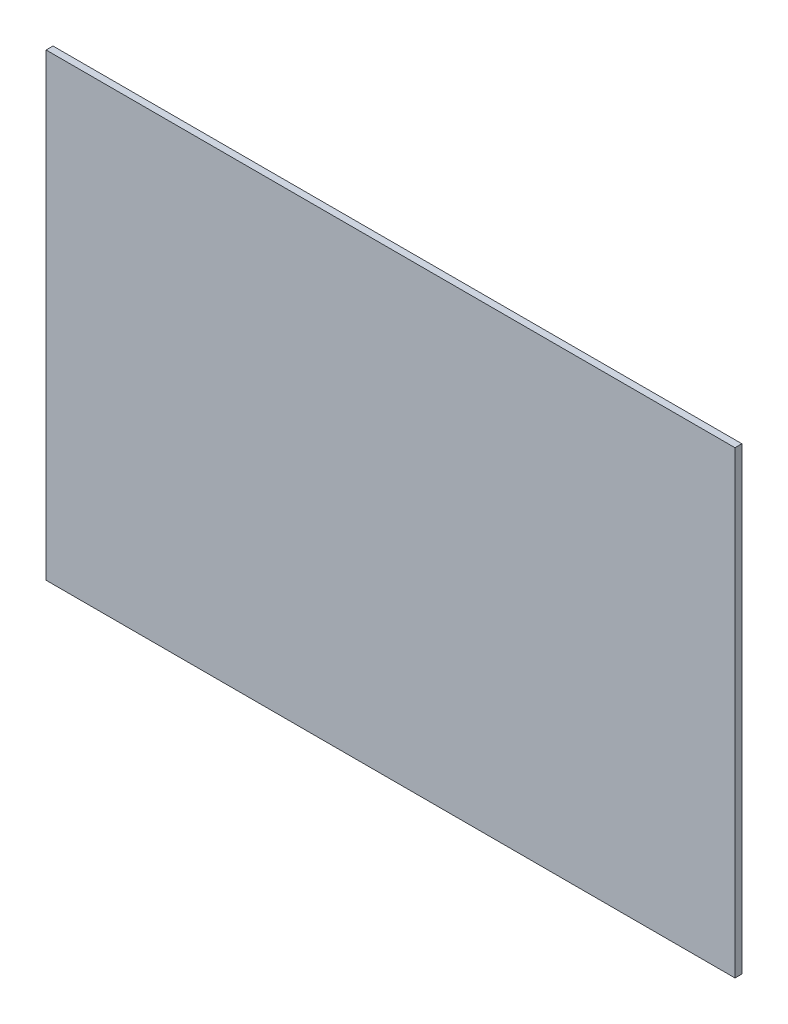
ISO-10303-21;
HEADER;
FILE_DESCRIPTION(('STEP AP214'),'2;1');
FILE_NAME('part.step','',(''),(''),'','','');
FILE_SCHEMA(('AUTOMOTIVE_DESIGN { 1 0 10303 214 1 1 1 1 }'));
ENDSEC;
DATA;
#1=APPLICATION_CONTEXT('core data for automotive mechanical design processes');
#2=APPLICATION_PROTOCOL_DEFINITION('international standard','automotive_design',2000,#1);
#3=PRODUCT_CONTEXT('',#1,'mechanical');
#4=PRODUCT('Part','Part','',(#3));
#5=PRODUCT_RELATED_PRODUCT_CATEGORY('part','',(#4));
#6=PRODUCT_DEFINITION_FORMATION('','',#4);
#7=PRODUCT_DEFINITION_CONTEXT('part definition',#1,'design');
#8=PRODUCT_DEFINITION('design','',#6,#7);
#9=PRODUCT_DEFINITION_SHAPE('','',#8);
#10=(LENGTH_UNIT() NAMED_UNIT(*) SI_UNIT(.MILLI.,.METRE.));
#11=(NAMED_UNIT(*) PLANE_ANGLE_UNIT() SI_UNIT($,.RADIAN.));
#12=(NAMED_UNIT(*) SI_UNIT($,.STERADIAN.) SOLID_ANGLE_UNIT());
#13=UNCERTAINTY_MEASURE_WITH_UNIT(LENGTH_MEASURE(1.E-05),#10,'distance_accuracy_value','');
#14=(GEOMETRIC_REPRESENTATION_CONTEXT(3) GLOBAL_UNCERTAINTY_ASSIGNED_CONTEXT((#13)) GLOBAL_UNIT_ASSIGNED_CONTEXT((#10,
#11,#12)) REPRESENTATION_CONTEXT('',''));
#15=CARTESIAN_POINT('',(0.,0.,0.));
#16=DIRECTION('',(0.,0.,1.));
#17=DIRECTION('',(1.,0.,0.));
#18=AXIS2_PLACEMENT_3D('',#15,#16,#17);
#19=CARTESIAN_POINT('',(726.421853185392,479.838709677419,15.));
#20=DIRECTION('',(-1.,0.,0.));
#21=DIRECTION('',(0.,-1.,0.));
#22=AXIS2_PLACEMENT_3D('',#19,#20,#21);
#23=PLANE('',#22);
#24=DIRECTION('',(0.,1.,0.));
#25=VECTOR('',#24,1.);
#26=CARTESIAN_POINT('',(726.421853185392,479.838709677419,0.));
#27=LINE('',#26,#25);
#28=CARTESIAN_POINT('',(726.421853185392,-520.161290322581,0.));
#29=VERTEX_POINT('',#28);
#30=CARTESIAN_POINT('',(726.421853185392,479.838709677419,0.));
#31=VERTEX_POINT('',#30);
#32=EDGE_CURVE('E96',#29,#31,#27,.T.);
#33=ORIENTED_EDGE('',*,*,#32,.T.);
#34=DIRECTION('',(0.,0.,-1.));
#35=VECTOR('',#34,1.);
#36=CARTESIAN_POINT('',(726.421853185392,479.838709677419,15.));
#37=LINE('',#36,#35);
#38=CARTESIAN_POINT('',(726.421853185392,479.838709677419,15.));
#39=VERTEX_POINT('',#38);
#40=EDGE_CURVE('E11',#39,#31,#37,.T.);
#41=ORIENTED_EDGE('',*,*,#40,.F.);
#42=DIRECTION('',(0.,1.,0.));
#43=VECTOR('',#42,1.);
#44=CARTESIAN_POINT('',(726.421853185392,479.838709677419,15.));
#45=LINE('',#44,#43);
#46=CARTESIAN_POINT('',(726.421853185392,-520.161290322581,15.));
#47=VERTEX_POINT('',#46);
#48=EDGE_CURVE('E84',#47,#39,#45,.T.);
#49=ORIENTED_EDGE('',*,*,#48,.F.);
#50=DIRECTION('',(0.,0.,-1.));
#51=VECTOR('',#50,1.);
#52=CARTESIAN_POINT('',(726.421853185392,-520.161290322581,15.));
#53=LINE('',#52,#51);
#54=EDGE_CURVE('E92',#47,#29,#53,.T.);
#55=ORIENTED_EDGE('',*,*,#54,.T.);
#56=EDGE_LOOP('',(#33,#41,#49,#55));
#57=FACE_BOUND('',#56,.T.);
#58=ADVANCED_FACE('F33',(#57),#23,.F.);
#59=CARTESIAN_POINT('',(-773.578146814608,479.838709677419,15.));
#60=DIRECTION('',(0.,-1.,0.));
#61=DIRECTION('',(0.,0.,-1.));
#62=AXIS2_PLACEMENT_3D('',#59,#60,#61);
#63=PLANE('',#62);
#64=DIRECTION('',(-1.,0.,0.));
#65=VECTOR('',#64,1.);
#66=CARTESIAN_POINT('',(-773.578146814608,479.838709677419,0.));
#67=LINE('',#66,#65);
#68=CARTESIAN_POINT('',(-773.578146814608,479.838709677419,0.));
#69=VERTEX_POINT('',#68);
#70=EDGE_CURVE('E88',#31,#69,#67,.T.);
#71=ORIENTED_EDGE('',*,*,#70,.T.);
#72=DIRECTION('',(0.,0.,-1.));
#73=VECTOR('',#72,1.);
#74=CARTESIAN_POINT('',(-773.578146814608,479.838709677419,15.));
#75=LINE('',#74,#73);
#76=CARTESIAN_POINT('',(-773.578146814608,479.838709677419,15.));
#77=VERTEX_POINT('',#76);
#78=EDGE_CURVE('E41',#77,#69,#75,.T.);
#79=ORIENTED_EDGE('',*,*,#78,.F.);
#80=DIRECTION('',(-1.,0.,0.));
#81=VECTOR('',#80,1.);
#82=CARTESIAN_POINT('',(-773.578146814608,479.838709677419,15.));
#83=LINE('',#82,#81);
#84=EDGE_CURVE('E79',#39,#77,#83,.T.);
#85=ORIENTED_EDGE('',*,*,#84,.F.);
#86=ORIENTED_EDGE('',*,*,#40,.T.);
#87=EDGE_LOOP('',(#71,#79,#85,#86));
#88=FACE_BOUND('',#87,.T.);
#89=ADVANCED_FACE('F87',(#88),#63,.F.);
#90=CARTESIAN_POINT('',(-773.578146814608,479.838709677419,15.));
#91=DIRECTION('',(1.,0.,0.));
#92=DIRECTION('',(0.,0.,-1.));
#93=AXIS2_PLACEMENT_3D('',#90,#91,#92);
#94=PLANE('',#93);
#95=DIRECTION('',(0.,-1.,0.));
#96=VECTOR('',#95,1.);
#97=CARTESIAN_POINT('',(-773.578146814608,479.838709677419,0.));
#98=LINE('',#97,#96);
#99=CARTESIAN_POINT('',(-773.578146814608,-520.161290322581,0.));
#100=VERTEX_POINT('',#99);
#101=EDGE_CURVE('E66',#69,#100,#98,.T.);
#102=ORIENTED_EDGE('',*,*,#101,.T.);
#103=DIRECTION('',(0.,0.,-1.));
#104=VECTOR('',#103,1.);
#105=CARTESIAN_POINT('',(-773.578146814608,-520.161290322581,15.));
#106=LINE('',#105,#104);
#107=CARTESIAN_POINT('',(-773.578146814608,-520.161290322581,15.));
#108=VERTEX_POINT('',#107);
#109=EDGE_CURVE('E89',#108,#100,#106,.T.);
#110=ORIENTED_EDGE('',*,*,#109,.F.);
#111=DIRECTION('',(0.,-1.,0.));
#112=VECTOR('',#111,1.);
#113=CARTESIAN_POINT('',(-773.578146814608,479.838709677419,15.));
#114=LINE('',#113,#112);
#115=EDGE_CURVE('E82',#77,#108,#114,.T.);
#116=ORIENTED_EDGE('',*,*,#115,.F.);
#117=ORIENTED_EDGE('',*,*,#78,.T.);
#118=EDGE_LOOP('',(#102,#110,#116,#117));
#119=FACE_BOUND('',#118,.T.);
#120=ADVANCED_FACE('F90',(#119),#94,.F.);
#121=CARTESIAN_POINT('',(-773.578146814608,-520.161290322581,15.));
#122=DIRECTION('',(0.,1.,0.));
#123=DIRECTION('',(0.,0.,1.));
#124=AXIS2_PLACEMENT_3D('',#121,#122,#123);
#125=PLANE('',#124);
#126=DIRECTION('',(1.,0.,0.));
#127=VECTOR('',#126,1.);
#128=CARTESIAN_POINT('',(-773.578146814608,-520.161290322581,0.));
#129=LINE('',#128,#127);
#130=EDGE_CURVE('E72',#100,#29,#129,.T.);
#131=ORIENTED_EDGE('',*,*,#130,.T.);
#132=ORIENTED_EDGE('',*,*,#54,.F.);
#133=DIRECTION('',(1.,0.,0.));
#134=VECTOR('',#133,1.);
#135=CARTESIAN_POINT('',(-773.578146814608,-520.161290322581,15.));
#136=LINE('',#135,#134);
#137=EDGE_CURVE('E49',#108,#47,#136,.T.);
#138=ORIENTED_EDGE('',*,*,#137,.F.);
#139=ORIENTED_EDGE('',*,*,#109,.T.);
#140=EDGE_LOOP('',(#131,#132,#138,#139));
#141=FACE_BOUND('',#140,.T.);
#142=ADVANCED_FACE('F103',(#141),#125,.F.);
#143=CARTESIAN_POINT('',(0.,0.,15.));
#144=DIRECTION('',(0.,0.,1.));
#145=DIRECTION('',(1.,0.,0.));
#146=AXIS2_PLACEMENT_3D('',#143,#144,#145);
#147=PLANE('',#146);
#148=ORIENTED_EDGE('',*,*,#48,.T.);
#149=ORIENTED_EDGE('',*,*,#84,.T.);
#150=ORIENTED_EDGE('',*,*,#115,.T.);
#151=ORIENTED_EDGE('',*,*,#137,.T.);
#152=EDGE_LOOP('',(#148,#149,#150,#151));
#153=FACE_BOUND('',#152,.T.);
#154=ADVANCED_FACE('F80',(#153),#147,.T.);
#155=CARTESIAN_POINT('',(0.,0.,0.));
#156=DIRECTION('',(0.,0.,1.));
#157=DIRECTION('',(1.,0.,0.));
#158=AXIS2_PLACEMENT_3D('',#155,#156,#157);
#159=PLANE('',#158);
#160=ORIENTED_EDGE('',*,*,#32,.F.);
#161=ORIENTED_EDGE('',*,*,#130,.F.);
#162=ORIENTED_EDGE('',*,*,#101,.F.);
#163=ORIENTED_EDGE('',*,*,#70,.F.);
#164=EDGE_LOOP('',(#160,#161,#162,#163));
#165=FACE_BOUND('',#164,.T.);
#166=ADVANCED_FACE('F106',(#165),#159,.F.);
#167=CLOSED_SHELL('',(#58,#89,#120,#142,#154,#166));
#168=MANIFOLD_SOLID_BREP('B2',#167);
#169=ADVANCED_BREP_SHAPE_REPRESENTATION('',(#18,#168),#14);
#170=SHAPE_DEFINITION_REPRESENTATION(#9,#169);
ENDSEC;
END-ISO-10303-21;
